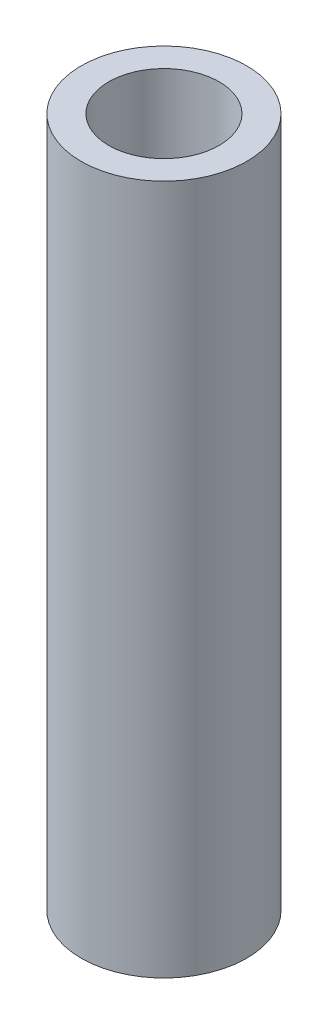
ISO-10303-21;
HEADER;
FILE_DESCRIPTION(('STEP AP214'),'2;1');
FILE_NAME('part.step','',(''),(''),'','','');
FILE_SCHEMA(('AUTOMOTIVE_DESIGN { 1 0 10303 214 1 1 1 1 }'));
ENDSEC;
DATA;
#1=APPLICATION_CONTEXT('core data for automotive mechanical design processes');
#2=APPLICATION_PROTOCOL_DEFINITION('international standard','automotive_design',2000,#1);
#3=PRODUCT_CONTEXT('',#1,'mechanical');
#4=PRODUCT('Part','Part','',(#3));
#5=PRODUCT_RELATED_PRODUCT_CATEGORY('part','',(#4));
#6=PRODUCT_DEFINITION_FORMATION('','',#4);
#7=PRODUCT_DEFINITION_CONTEXT('part definition',#1,'design');
#8=PRODUCT_DEFINITION('design','',#6,#7);
#9=PRODUCT_DEFINITION_SHAPE('','',#8);
#10=(LENGTH_UNIT() NAMED_UNIT(*) SI_UNIT(.MILLI.,.METRE.));
#11=(NAMED_UNIT(*) PLANE_ANGLE_UNIT() SI_UNIT($,.RADIAN.));
#12=(NAMED_UNIT(*) SI_UNIT($,.STERADIAN.) SOLID_ANGLE_UNIT());
#13=UNCERTAINTY_MEASURE_WITH_UNIT(LENGTH_MEASURE(1.E-05),#10,'distance_accuracy_value','');
#14=(GEOMETRIC_REPRESENTATION_CONTEXT(3) GLOBAL_UNCERTAINTY_ASSIGNED_CONTEXT((#13)) GLOBAL_UNIT_ASSIGNED_CONTEXT((#10,
#11,#12)) REPRESENTATION_CONTEXT('',''));
#15=CARTESIAN_POINT('',(0.,0.,0.));
#16=DIRECTION('',(0.,0.,1.));
#17=DIRECTION('',(1.,0.,0.));
#18=AXIS2_PLACEMENT_3D('',#15,#16,#17);
#19=CARTESIAN_POINT('',(0.,13.4683406425655,0.));
#20=DIRECTION('',(0.,1.,0.));
#21=DIRECTION('',(0.,0.,1.));
#22=AXIS2_PLACEMENT_3D('',#19,#20,#21);
#23=CYLINDRICAL_SURFACE('',#22,1.);
#24=CARTESIAN_POINT('',(0.,-11.5316593574345,0.));
#25=DIRECTION('',(0.,1.,0.));
#26=DIRECTION('',(0.,0.,1.));
#27=AXIS2_PLACEMENT_3D('',#24,#25,#26);
#28=CIRCLE('',#27,1.);
#29=CARTESIAN_POINT('',(0.,-11.5316593574345,1.));
#30=VERTEX_POINT('',#29);
#31=EDGE_CURVE('E42',#30,#30,#28,.T.);
#32=ORIENTED_EDGE('',*,*,#31,.F.);
#33=EDGE_LOOP('',(#32));
#34=FACE_BOUND('',#33,.T.);
#35=CARTESIAN_POINT('',(0.,3.46834064256552,0.));
#36=DIRECTION('',(0.,1.,0.));
#37=DIRECTION('',(0.,0.,1.));
#38=AXIS2_PLACEMENT_3D('',#35,#36,#37);
#39=CIRCLE('',#38,1.);
#40=CARTESIAN_POINT('',(0.,3.46834064256552,1.));
#41=VERTEX_POINT('',#40);
#42=EDGE_CURVE('E34',#41,#41,#39,.F.);
#43=ORIENTED_EDGE('',*,*,#42,.F.);
#44=EDGE_LOOP('',(#43));
#45=FACE_BOUND('',#44,.T.);
#46=ADVANCED_FACE('F31',(#34,#45),#23,.F.);
#47=CARTESIAN_POINT('',(0.,13.4683406425655,-1.));
#48=DIRECTION('',(0.,-1.,0.));
#49=DIRECTION('',(0.,0.,-1.));
#50=AXIS2_PLACEMENT_3D('',#47,#48,#49);
#51=PLANE('',#50);
#52=CARTESIAN_POINT('',(0.,13.4683406425655,0.));
#53=DIRECTION('',(0.,1.,0.));
#54=DIRECTION('',(0.,0.,1.));
#55=AXIS2_PLACEMENT_3D('',#52,#53,#54);
#56=CIRCLE('',#55,2.);
#57=CARTESIAN_POINT('',(0.,13.4683406425655,1.99999999999999));
#58=VERTEX_POINT('',#57);
#59=EDGE_CURVE('E47',#58,#58,#56,.T.);
#60=ORIENTED_EDGE('',*,*,#59,.F.);
#61=EDGE_LOOP('',(#60));
#62=FACE_BOUND('',#61,.T.);
#63=CARTESIAN_POINT('',(0.,13.4683406425655,0.));
#64=DIRECTION('',(0.,1.,0.));
#65=DIRECTION('',(0.,0.,1.));
#66=AXIS2_PLACEMENT_3D('',#63,#64,#65);
#67=CIRCLE('',#66,3.);
#68=CARTESIAN_POINT('',(0.,13.4683406425655,3.));
#69=VERTEX_POINT('',#68);
#70=EDGE_CURVE('E10',#69,#69,#67,.T.);
#71=ORIENTED_EDGE('',*,*,#70,.T.);
#72=EDGE_LOOP('',(#71));
#73=FACE_BOUND('',#72,.T.);
#74=ADVANCED_FACE('F60',(#62,#73),#51,.F.);
#75=CARTESIAN_POINT('',(0.,13.4683406425655,0.));
#76=DIRECTION('',(0.,1.,0.));
#77=DIRECTION('',(0.,0.,1.));
#78=AXIS2_PLACEMENT_3D('',#75,#76,#77);
#79=CYLINDRICAL_SURFACE('',#78,3.);
#80=ORIENTED_EDGE('',*,*,#70,.F.);
#81=EDGE_LOOP('',(#80));
#82=FACE_BOUND('',#81,.T.);
#83=CARTESIAN_POINT('',(0.,-11.5316593574345,0.));
#84=DIRECTION('',(0.,1.,0.));
#85=DIRECTION('',(0.,0.,1.));
#86=AXIS2_PLACEMENT_3D('',#83,#84,#85);
#87=CIRCLE('',#86,3.);
#88=CARTESIAN_POINT('',(0.,-11.5316593574345,3.));
#89=VERTEX_POINT('',#88);
#90=EDGE_CURVE('E38',#89,#89,#87,.T.);
#91=ORIENTED_EDGE('',*,*,#90,.T.);
#92=EDGE_LOOP('',(#91));
#93=FACE_BOUND('',#92,.T.);
#94=ADVANCED_FACE('F65',(#82,#93),#79,.T.);
#95=CARTESIAN_POINT('',(0.,-11.5316593574345,-3.));
#96=DIRECTION('',(0.,1.,0.));
#97=DIRECTION('',(0.,0.,1.));
#98=AXIS2_PLACEMENT_3D('',#95,#96,#97);
#99=PLANE('',#98);
#100=ORIENTED_EDGE('',*,*,#90,.F.);
#101=EDGE_LOOP('',(#100));
#102=FACE_BOUND('',#101,.T.);
#103=ORIENTED_EDGE('',*,*,#31,.T.);
#104=EDGE_LOOP('',(#103));
#105=FACE_BOUND('',#104,.T.);
#106=ADVANCED_FACE('F69',(#102,#105),#99,.F.);
#107=CARTESIAN_POINT('',(0.,3.46834064256552,0.));
#108=DIRECTION('',(0.,1.,0.));
#109=DIRECTION('',(0.,0.,1.));
#110=AXIS2_PLACEMENT_3D('',#107,#108,#109);
#111=PLANE('',#110);
#112=CARTESIAN_POINT('',(0.,3.46834064256552,0.));
#113=DIRECTION('',(0.,1.,0.));
#114=DIRECTION('',(0.,0.,1.));
#115=AXIS2_PLACEMENT_3D('',#112,#113,#114);
#116=CIRCLE('',#115,2.);
#117=CARTESIAN_POINT('',(0.,3.46834064256552,1.99999999999999));
#118=VERTEX_POINT('',#117);
#119=EDGE_CURVE('E50',#118,#118,#116,.T.);
#120=ORIENTED_EDGE('',*,*,#119,.T.);
#121=EDGE_LOOP('',(#120));
#122=FACE_BOUND('',#121,.T.);
#123=ORIENTED_EDGE('',*,*,#42,.T.);
#124=EDGE_LOOP('',(#123));
#125=FACE_BOUND('',#124,.T.);
#126=ADVANCED_FACE('F57',(#122,#125),#111,.T.);
#127=CARTESIAN_POINT('',(0.,3.46834064256552,0.));
#128=DIRECTION('',(0.,1.,0.));
#129=DIRECTION('',(0.,0.,1.));
#130=AXIS2_PLACEMENT_3D('',#127,#128,#129);
#131=CYLINDRICAL_SURFACE('',#130,2.);
#132=ORIENTED_EDGE('',*,*,#119,.F.);
#133=EDGE_LOOP('',(#132));
#134=FACE_BOUND('',#133,.T.);
#135=ORIENTED_EDGE('',*,*,#59,.T.);
#136=EDGE_LOOP('',(#135));
#137=FACE_BOUND('',#136,.T.);
#138=ADVANCED_FACE('F77',(#134,#137),#131,.F.);
#139=CLOSED_SHELL('',(#46,#74,#94,#106,#126,#138));
#140=MANIFOLD_SOLID_BREP('B2',#139);
#141=ADVANCED_BREP_SHAPE_REPRESENTATION('',(#18,#140),#14);
#142=SHAPE_DEFINITION_REPRESENTATION(#9,#141);
ENDSEC;
END-ISO-10303-21;
